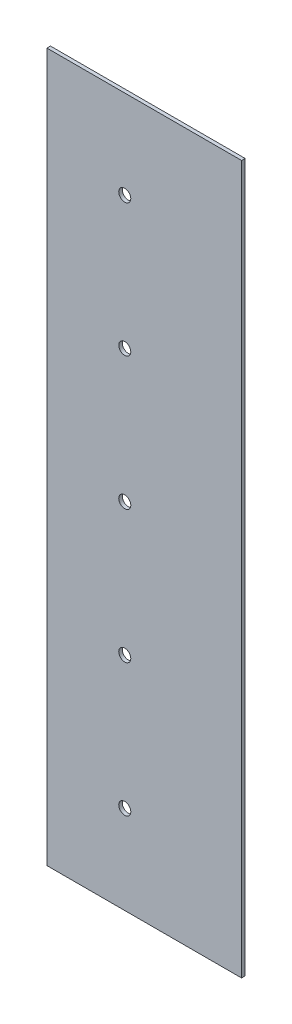
ISO-10303-21;
HEADER;
FILE_DESCRIPTION(('STEP AP214'),'2;1');
FILE_NAME('part.step','',(''),(''),'','','');
FILE_SCHEMA(('AUTOMOTIVE_DESIGN { 1 0 10303 214 1 1 1 1 }'));
ENDSEC;
DATA;
#1=APPLICATION_CONTEXT('core data for automotive mechanical design processes');
#2=APPLICATION_PROTOCOL_DEFINITION('international standard','automotive_design',2000,#1);
#3=PRODUCT_CONTEXT('',#1,'mechanical');
#4=PRODUCT('Part','Part','',(#3));
#5=PRODUCT_RELATED_PRODUCT_CATEGORY('part','',(#4));
#6=PRODUCT_DEFINITION_FORMATION('','',#4);
#7=PRODUCT_DEFINITION_CONTEXT('part definition',#1,'design');
#8=PRODUCT_DEFINITION('design','',#6,#7);
#9=PRODUCT_DEFINITION_SHAPE('','',#8);
#10=(LENGTH_UNIT() NAMED_UNIT(*) SI_UNIT(.MILLI.,.METRE.));
#11=(NAMED_UNIT(*) PLANE_ANGLE_UNIT() SI_UNIT($,.RADIAN.));
#12=(NAMED_UNIT(*) SI_UNIT($,.STERADIAN.) SOLID_ANGLE_UNIT());
#13=UNCERTAINTY_MEASURE_WITH_UNIT(LENGTH_MEASURE(1.E-05),#10,'distance_accuracy_value','');
#14=(GEOMETRIC_REPRESENTATION_CONTEXT(3) GLOBAL_UNCERTAINTY_ASSIGNED_CONTEXT((#13)) GLOBAL_UNIT_ASSIGNED_CONTEXT((#10,
#11,#12)) REPRESENTATION_CONTEXT('',''));
#15=CARTESIAN_POINT('',(0.,0.,0.));
#16=DIRECTION('',(0.,0.,1.));
#17=DIRECTION('',(1.,0.,0.));
#18=AXIS2_PLACEMENT_3D('',#15,#16,#17);
#19=CARTESIAN_POINT('',(0.,0.,1.));
#20=DIRECTION('',(1.,0.,0.));
#21=DIRECTION('',(0.,0.,-1.));
#22=AXIS2_PLACEMENT_3D('',#19,#20,#21);
#23=PLANE('',#22);
#24=DIRECTION('',(0.,-1.,0.));
#25=VECTOR('',#24,1.);
#26=CARTESIAN_POINT('',(0.,0.,0.));
#27=LINE('',#26,#25);
#28=CARTESIAN_POINT('',(0.,200.,0.));
#29=VERTEX_POINT('',#28);
#30=CARTESIAN_POINT('',(0.,0.,0.));
#31=VERTEX_POINT('',#30);
#32=EDGE_CURVE('E97',#29,#31,#27,.T.);
#33=ORIENTED_EDGE('',*,*,#32,.T.);
#34=DIRECTION('',(0.,0.,-1.));
#35=VECTOR('',#34,1.);
#36=CARTESIAN_POINT('',(0.,0.,1.));
#37=LINE('',#36,#35);
#38=CARTESIAN_POINT('',(0.,0.,1.));
#39=VERTEX_POINT('',#38);
#40=EDGE_CURVE('E11',#39,#31,#37,.T.);
#41=ORIENTED_EDGE('',*,*,#40,.F.);
#42=DIRECTION('',(0.,-1.,0.));
#43=VECTOR('',#42,1.);
#44=CARTESIAN_POINT('',(0.,0.,1.));
#45=LINE('',#44,#43);
#46=CARTESIAN_POINT('',(0.,200.,1.));
#47=VERTEX_POINT('',#46);
#48=EDGE_CURVE('E85',#47,#39,#45,.T.);
#49=ORIENTED_EDGE('',*,*,#48,.F.);
#50=DIRECTION('',(0.,0.,-1.));
#51=VECTOR('',#50,1.);
#52=CARTESIAN_POINT('',(0.,200.,1.));
#53=LINE('',#52,#51);
#54=EDGE_CURVE('E93',#47,#29,#53,.T.);
#55=ORIENTED_EDGE('',*,*,#54,.T.);
#56=EDGE_LOOP('',(#33,#41,#49,#55));
#57=FACE_BOUND('',#56,.T.);
#58=ADVANCED_FACE('F34',(#57),#23,.F.);
#59=CARTESIAN_POINT('',(0.,0.,1.));
#60=DIRECTION('',(0.,1.,0.));
#61=DIRECTION('',(0.,0.,1.));
#62=AXIS2_PLACEMENT_3D('',#59,#60,#61);
#63=PLANE('',#62);
#64=DIRECTION('',(1.,0.,0.));
#65=VECTOR('',#64,1.);
#66=CARTESIAN_POINT('',(0.,0.,0.));
#67=LINE('',#66,#65);
#68=CARTESIAN_POINT('',(55.,0.,0.));
#69=VERTEX_POINT('',#68);
#70=EDGE_CURVE('E89',#31,#69,#67,.T.);
#71=ORIENTED_EDGE('',*,*,#70,.T.);
#72=DIRECTION('',(0.,0.,-1.));
#73=VECTOR('',#72,1.);
#74=CARTESIAN_POINT('',(55.,0.,1.));
#75=LINE('',#74,#73);
#76=CARTESIAN_POINT('',(55.,0.,1.));
#77=VERTEX_POINT('',#76);
#78=EDGE_CURVE('E42',#77,#69,#75,.T.);
#79=ORIENTED_EDGE('',*,*,#78,.F.);
#80=DIRECTION('',(1.,0.,0.));
#81=VECTOR('',#80,1.);
#82=CARTESIAN_POINT('',(0.,0.,1.));
#83=LINE('',#82,#81);
#84=EDGE_CURVE('E80',#39,#77,#83,.T.);
#85=ORIENTED_EDGE('',*,*,#84,.F.);
#86=ORIENTED_EDGE('',*,*,#40,.T.);
#87=EDGE_LOOP('',(#71,#79,#85,#86));
#88=FACE_BOUND('',#87,.T.);
#89=ADVANCED_FACE('F88',(#88),#63,.F.);
#90=CARTESIAN_POINT('',(55.,0.,1.));
#91=DIRECTION('',(-1.,0.,0.));
#92=DIRECTION('',(0.,0.,1.));
#93=AXIS2_PLACEMENT_3D('',#90,#91,#92);
#94=PLANE('',#93);
#95=DIRECTION('',(0.,1.,0.));
#96=VECTOR('',#95,1.);
#97=CARTESIAN_POINT('',(55.,0.,0.));
#98=LINE('',#97,#96);
#99=CARTESIAN_POINT('',(55.,200.,0.));
#100=VERTEX_POINT('',#99);
#101=EDGE_CURVE('E67',#69,#100,#98,.T.);
#102=ORIENTED_EDGE('',*,*,#101,.T.);
#103=DIRECTION('',(0.,0.,-1.));
#104=VECTOR('',#103,1.);
#105=CARTESIAN_POINT('',(55.,200.,1.));
#106=LINE('',#105,#104);
#107=CARTESIAN_POINT('',(55.,200.,1.));
#108=VERTEX_POINT('',#107);
#109=EDGE_CURVE('E90',#108,#100,#106,.T.);
#110=ORIENTED_EDGE('',*,*,#109,.F.);
#111=DIRECTION('',(0.,1.,0.));
#112=VECTOR('',#111,1.);
#113=CARTESIAN_POINT('',(55.,0.,1.));
#114=LINE('',#113,#112);
#115=EDGE_CURVE('E83',#77,#108,#114,.T.);
#116=ORIENTED_EDGE('',*,*,#115,.F.);
#117=ORIENTED_EDGE('',*,*,#78,.T.);
#118=EDGE_LOOP('',(#102,#110,#116,#117));
#119=FACE_BOUND('',#118,.T.);
#120=ADVANCED_FACE('F91',(#119),#94,.F.);
#121=CARTESIAN_POINT('',(0.,200.,1.));
#122=DIRECTION('',(0.,-1.,0.));
#123=DIRECTION('',(0.,0.,-1.));
#124=AXIS2_PLACEMENT_3D('',#121,#122,#123);
#125=PLANE('',#124);
#126=DIRECTION('',(-1.,0.,0.));
#127=VECTOR('',#126,1.);
#128=CARTESIAN_POINT('',(0.,200.,0.));
#129=LINE('',#128,#127);
#130=EDGE_CURVE('E73',#100,#29,#129,.T.);
#131=ORIENTED_EDGE('',*,*,#130,.T.);
#132=ORIENTED_EDGE('',*,*,#54,.F.);
#133=DIRECTION('',(-1.,0.,0.));
#134=VECTOR('',#133,1.);
#135=CARTESIAN_POINT('',(0.,200.,1.));
#136=LINE('',#135,#134);
#137=EDGE_CURVE('E50',#108,#47,#136,.T.);
#138=ORIENTED_EDGE('',*,*,#137,.F.);
#139=ORIENTED_EDGE('',*,*,#109,.T.);
#140=EDGE_LOOP('',(#131,#132,#138,#139));
#141=FACE_BOUND('',#140,.T.);
#142=ADVANCED_FACE('F105',(#141),#125,.F.);
#143=CARTESIAN_POINT('',(0.,200.,1.));
#144=DIRECTION('',(0.,0.,-1.));
#145=DIRECTION('',(-1.,0.,0.));
#146=AXIS2_PLACEMENT_3D('',#143,#144,#145);
#147=PLANE('',#146);
#148=CARTESIAN_POINT('',(22.,175.,1.));
#149=DIRECTION('',(0.,0.,-1.));
#150=DIRECTION('',(-1.,0.,0.));
#151=AXIS2_PLACEMENT_3D('',#148,#149,#150);
#152=CIRCLE('',#151,1.7);
#153=CARTESIAN_POINT('',(20.3,175.,1.));
#154=VERTEX_POINT('',#153);
#155=EDGE_CURVE('E134',#154,#154,#152,.T.);
#156=ORIENTED_EDGE('',*,*,#155,.T.);
#157=EDGE_LOOP('',(#156));
#158=FACE_BOUND('',#157,.T.);
#159=CARTESIAN_POINT('',(22.,137.5,1.));
#160=DIRECTION('',(0.,0.,-1.));
#161=DIRECTION('',(-1.,0.,0.));
#162=AXIS2_PLACEMENT_3D('',#159,#160,#161);
#163=CIRCLE('',#162,1.7);
#164=CARTESIAN_POINT('',(20.3,137.5,1.));
#165=VERTEX_POINT('',#164);
#166=EDGE_CURVE('E128',#165,#165,#163,.T.);
#167=ORIENTED_EDGE('',*,*,#166,.T.);
#168=EDGE_LOOP('',(#167));
#169=FACE_BOUND('',#168,.T.);
#170=CARTESIAN_POINT('',(22.,100.,1.));
#171=DIRECTION('',(0.,0.,-1.));
#172=DIRECTION('',(-1.,0.,0.));
#173=AXIS2_PLACEMENT_3D('',#170,#171,#172);
#174=CIRCLE('',#173,1.7);
#175=CARTESIAN_POINT('',(20.3,100.,1.));
#176=VERTEX_POINT('',#175);
#177=EDGE_CURVE('E122',#176,#176,#174,.T.);
#178=ORIENTED_EDGE('',*,*,#177,.T.);
#179=EDGE_LOOP('',(#178));
#180=FACE_BOUND('',#179,.T.);
#181=CARTESIAN_POINT('',(22.,62.5,1.));
#182=DIRECTION('',(0.,0.,-1.));
#183=DIRECTION('',(-1.,0.,0.));
#184=AXIS2_PLACEMENT_3D('',#181,#182,#183);
#185=CIRCLE('',#184,1.7);
#186=CARTESIAN_POINT('',(20.3,62.5,1.));
#187=VERTEX_POINT('',#186);
#188=EDGE_CURVE('E116',#187,#187,#185,.T.);
#189=ORIENTED_EDGE('',*,*,#188,.T.);
#190=EDGE_LOOP('',(#189));
#191=FACE_BOUND('',#190,.T.);
#192=CARTESIAN_POINT('',(22.,25.,1.));
#193=DIRECTION('',(0.,0.,-1.));
#194=DIRECTION('',(-1.,0.,0.));
#195=AXIS2_PLACEMENT_3D('',#192,#193,#194);
#196=CIRCLE('',#195,1.7);
#197=CARTESIAN_POINT('',(20.3,25.,1.));
#198=VERTEX_POINT('',#197);
#199=EDGE_CURVE('E100',#198,#198,#196,.T.);
#200=ORIENTED_EDGE('',*,*,#199,.T.);
#201=EDGE_LOOP('',(#200));
#202=FACE_BOUND('',#201,.T.);
#203=ORIENTED_EDGE('',*,*,#48,.T.);
#204=ORIENTED_EDGE('',*,*,#84,.T.);
#205=ORIENTED_EDGE('',*,*,#115,.T.);
#206=ORIENTED_EDGE('',*,*,#137,.T.);
#207=EDGE_LOOP('',(#203,#204,#205,#206));
#208=FACE_BOUND('',#207,.T.);
#209=ADVANCED_FACE('F81',(#158,#169,#180,#191,#202,#208),#147,.F.);
#210=CARTESIAN_POINT('',(0.,200.,0.));
#211=DIRECTION('',(0.,0.,-1.));
#212=DIRECTION('',(-1.,0.,0.));
#213=AXIS2_PLACEMENT_3D('',#210,#211,#212);
#214=PLANE('',#213);
#215=CARTESIAN_POINT('',(22.,175.,0.));
#216=DIRECTION('',(0.,0.,-1.));
#217=DIRECTION('',(-1.,0.,0.));
#218=AXIS2_PLACEMENT_3D('',#215,#216,#217);
#219=CIRCLE('',#218,1.7);
#220=CARTESIAN_POINT('',(20.3,175.,0.));
#221=VERTEX_POINT('',#220);
#222=EDGE_CURVE('E137',#221,#221,#219,.T.);
#223=ORIENTED_EDGE('',*,*,#222,.F.);
#224=EDGE_LOOP('',(#223));
#225=FACE_BOUND('',#224,.T.);
#226=CARTESIAN_POINT('',(22.,137.5,0.));
#227=DIRECTION('',(0.,0.,-1.));
#228=DIRECTION('',(-1.,0.,0.));
#229=AXIS2_PLACEMENT_3D('',#226,#227,#228);
#230=CIRCLE('',#229,1.7);
#231=CARTESIAN_POINT('',(20.3,137.5,0.));
#232=VERTEX_POINT('',#231);
#233=EDGE_CURVE('E131',#232,#232,#230,.T.);
#234=ORIENTED_EDGE('',*,*,#233,.F.);
#235=EDGE_LOOP('',(#234));
#236=FACE_BOUND('',#235,.T.);
#237=CARTESIAN_POINT('',(22.,100.,0.));
#238=DIRECTION('',(0.,0.,-1.));
#239=DIRECTION('',(-1.,0.,0.));
#240=AXIS2_PLACEMENT_3D('',#237,#238,#239);
#241=CIRCLE('',#240,1.7);
#242=CARTESIAN_POINT('',(20.3,100.,0.));
#243=VERTEX_POINT('',#242);
#244=EDGE_CURVE('E125',#243,#243,#241,.T.);
#245=ORIENTED_EDGE('',*,*,#244,.F.);
#246=EDGE_LOOP('',(#245));
#247=FACE_BOUND('',#246,.T.);
#248=CARTESIAN_POINT('',(22.,62.5,0.));
#249=DIRECTION('',(0.,0.,-1.));
#250=DIRECTION('',(-1.,0.,0.));
#251=AXIS2_PLACEMENT_3D('',#248,#249,#250);
#252=CIRCLE('',#251,1.7);
#253=CARTESIAN_POINT('',(20.3,62.5,0.));
#254=VERTEX_POINT('',#253);
#255=EDGE_CURVE('E119',#254,#254,#252,.T.);
#256=ORIENTED_EDGE('',*,*,#255,.F.);
#257=EDGE_LOOP('',(#256));
#258=FACE_BOUND('',#257,.T.);
#259=CARTESIAN_POINT('',(22.,25.,0.));
#260=DIRECTION('',(0.,0.,-1.));
#261=DIRECTION('',(-1.,0.,0.));
#262=AXIS2_PLACEMENT_3D('',#259,#260,#261);
#263=CIRCLE('',#262,1.7);
#264=CARTESIAN_POINT('',(20.3,25.,0.));
#265=VERTEX_POINT('',#264);
#266=EDGE_CURVE('E113',#265,#265,#263,.T.);
#267=ORIENTED_EDGE('',*,*,#266,.F.);
#268=EDGE_LOOP('',(#267));
#269=FACE_BOUND('',#268,.T.);
#270=ORIENTED_EDGE('',*,*,#32,.F.);
#271=ORIENTED_EDGE('',*,*,#130,.F.);
#272=ORIENTED_EDGE('',*,*,#101,.F.);
#273=ORIENTED_EDGE('',*,*,#70,.F.);
#274=EDGE_LOOP('',(#270,#271,#272,#273));
#275=FACE_BOUND('',#274,.T.);
#276=ADVANCED_FACE('F108',(#225,#236,#247,#258,#269,#275),#214,.T.);
#277=CARTESIAN_POINT('',(22.,25.,0.));
#278=DIRECTION('',(0.,0.,-1.));
#279=DIRECTION('',(-1.,0.,0.));
#280=AXIS2_PLACEMENT_3D('',#277,#278,#279);
#281=CYLINDRICAL_SURFACE('',#280,1.7);
#282=ORIENTED_EDGE('',*,*,#266,.T.);
#283=EDGE_LOOP('',(#282));
#284=FACE_BOUND('',#283,.T.);
#285=ORIENTED_EDGE('',*,*,#199,.F.);
#286=EDGE_LOOP('',(#285));
#287=FACE_BOUND('',#286,.T.);
#288=ADVANCED_FACE('F146',(#284,#287),#281,.F.);
#289=CARTESIAN_POINT('',(22.,62.5,0.));
#290=DIRECTION('',(0.,0.,-1.));
#291=DIRECTION('',(-1.,0.,0.));
#292=AXIS2_PLACEMENT_3D('',#289,#290,#291);
#293=CYLINDRICAL_SURFACE('',#292,1.7);
#294=ORIENTED_EDGE('',*,*,#255,.T.);
#295=EDGE_LOOP('',(#294));
#296=FACE_BOUND('',#295,.T.);
#297=ORIENTED_EDGE('',*,*,#188,.F.);
#298=EDGE_LOOP('',(#297));
#299=FACE_BOUND('',#298,.T.);
#300=ADVANCED_FACE('F158',(#296,#299),#293,.F.);
#301=CARTESIAN_POINT('',(22.,100.,0.));
#302=DIRECTION('',(0.,0.,-1.));
#303=DIRECTION('',(-1.,0.,0.));
#304=AXIS2_PLACEMENT_3D('',#301,#302,#303);
#305=CYLINDRICAL_SURFACE('',#304,1.7);
#306=ORIENTED_EDGE('',*,*,#244,.T.);
#307=EDGE_LOOP('',(#306));
#308=FACE_BOUND('',#307,.T.);
#309=ORIENTED_EDGE('',*,*,#177,.F.);
#310=EDGE_LOOP('',(#309));
#311=FACE_BOUND('',#310,.T.);
#312=ADVANCED_FACE('F209',(#308,#311),#305,.F.);
#313=CARTESIAN_POINT('',(22.,137.5,0.));
#314=DIRECTION('',(0.,0.,-1.));
#315=DIRECTION('',(-1.,0.,0.));
#316=AXIS2_PLACEMENT_3D('',#313,#314,#315);
#317=CYLINDRICAL_SURFACE('',#316,1.7);
#318=ORIENTED_EDGE('',*,*,#233,.T.);
#319=EDGE_LOOP('',(#318));
#320=FACE_BOUND('',#319,.T.);
#321=ORIENTED_EDGE('',*,*,#166,.F.);
#322=EDGE_LOOP('',(#321));
#323=FACE_BOUND('',#322,.T.);
#324=ADVANCED_FACE('F219',(#320,#323),#317,.F.);
#325=CARTESIAN_POINT('',(22.,175.,0.));
#326=DIRECTION('',(0.,0.,-1.));
#327=DIRECTION('',(-1.,0.,0.));
#328=AXIS2_PLACEMENT_3D('',#325,#326,#327);
#329=CYLINDRICAL_SURFACE('',#328,1.7);
#330=ORIENTED_EDGE('',*,*,#222,.T.);
#331=EDGE_LOOP('',(#330));
#332=FACE_BOUND('',#331,.T.);
#333=ORIENTED_EDGE('',*,*,#155,.F.);
#334=EDGE_LOOP('',(#333));
#335=FACE_BOUND('',#334,.T.);
#336=ADVANCED_FACE('F141',(#332,#335),#329,.F.);
#337=CLOSED_SHELL('',(#58,#89,#120,#142,#209,#276,#288,#300,#312,#324,#336));
#338=MANIFOLD_SOLID_BREP('B2',#337);
#339=ADVANCED_BREP_SHAPE_REPRESENTATION('',(#18,#338),#14);
#340=SHAPE_DEFINITION_REPRESENTATION(#9,#339);
ENDSEC;
END-ISO-10303-21;
